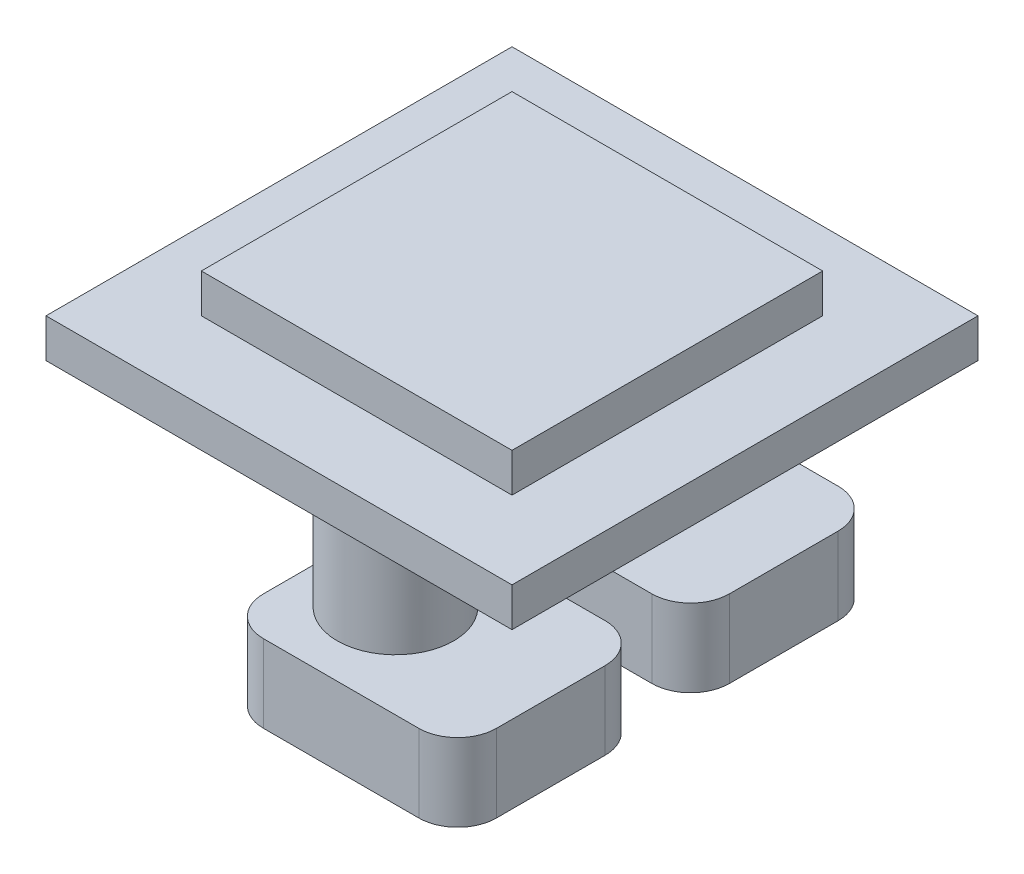
ISO-10303-21;
HEADER;
FILE_DESCRIPTION(('STEP AP214'),'2;1');
FILE_NAME('part.step','',(''),(''),'','','');
FILE_SCHEMA(('AUTOMOTIVE_DESIGN { 1 0 10303 214 1 1 1 1 }'));
ENDSEC;
DATA;
#1=APPLICATION_CONTEXT('core data for automotive mechanical design processes');
#2=APPLICATION_PROTOCOL_DEFINITION('international standard','automotive_design',2000,#1);
#3=PRODUCT_CONTEXT('',#1,'mechanical');
#4=PRODUCT('Part','Part','',(#3));
#5=PRODUCT_RELATED_PRODUCT_CATEGORY('part','',(#4));
#6=PRODUCT_DEFINITION_FORMATION('','',#4);
#7=PRODUCT_DEFINITION_CONTEXT('part definition',#1,'design');
#8=PRODUCT_DEFINITION('design','',#6,#7);
#9=PRODUCT_DEFINITION_SHAPE('','',#8);
#10=(LENGTH_UNIT() NAMED_UNIT(*) SI_UNIT(.MILLI.,.METRE.));
#11=(NAMED_UNIT(*) PLANE_ANGLE_UNIT() SI_UNIT($,.RADIAN.));
#12=(NAMED_UNIT(*) SI_UNIT($,.STERADIAN.) SOLID_ANGLE_UNIT());
#13=UNCERTAINTY_MEASURE_WITH_UNIT(LENGTH_MEASURE(1.E-05),#10,'distance_accuracy_value','');
#14=(GEOMETRIC_REPRESENTATION_CONTEXT(3) GLOBAL_UNCERTAINTY_ASSIGNED_CONTEXT((#13)) GLOBAL_UNIT_ASSIGNED_CONTEXT((#10,
#11,#12)) REPRESENTATION_CONTEXT('',''));
#15=CARTESIAN_POINT('',(0.,0.,0.));
#16=DIRECTION('',(0.,0.,1.));
#17=DIRECTION('',(1.,0.,0.));
#18=AXIS2_PLACEMENT_3D('',#15,#16,#17);
#19=CARTESIAN_POINT('',(0.,5.,0.));
#20=DIRECTION('',(1.,0.,0.));
#21=DIRECTION('',(0.,0.,-1.));
#22=AXIS2_PLACEMENT_3D('',#19,#20,#21);
#23=PLANE('',#22);
#24=DIRECTION('',(0.,0.,1.));
#25=VECTOR('',#24,1.);
#26=CARTESIAN_POINT('',(0.,0.,0.));
#27=LINE('',#26,#25);
#28=CARTESIAN_POINT('',(0.,0.,-40.));
#29=VERTEX_POINT('',#28);
#30=CARTESIAN_POINT('',(0.,0.,0.));
#31=VERTEX_POINT('',#30);
#32=EDGE_CURVE('E226',#29,#31,#27,.T.);
#33=ORIENTED_EDGE('',*,*,#32,.T.);
#34=DIRECTION('',(0.,-1.,0.));
#35=VECTOR('',#34,1.);
#36=CARTESIAN_POINT('',(0.,5.,0.));
#37=LINE('',#36,#35);
#38=CARTESIAN_POINT('',(0.,5.,0.));
#39=VERTEX_POINT('',#38);
#40=EDGE_CURVE('E261',#39,#31,#37,.T.);
#41=ORIENTED_EDGE('',*,*,#40,.F.);
#42=DIRECTION('',(0.,0.,1.));
#43=VECTOR('',#42,1.);
#44=CARTESIAN_POINT('',(0.,5.,0.));
#45=LINE('',#44,#43);
#46=CARTESIAN_POINT('',(0.,5.,-40.));
#47=VERTEX_POINT('',#46);
#48=EDGE_CURVE('E235',#47,#39,#45,.T.);
#49=ORIENTED_EDGE('',*,*,#48,.F.);
#50=DIRECTION('',(0.,-1.,0.));
#51=VECTOR('',#50,1.);
#52=CARTESIAN_POINT('',(0.,5.,-40.));
#53=LINE('',#52,#51);
#54=EDGE_CURVE('E244',#47,#29,#53,.T.);
#55=ORIENTED_EDGE('',*,*,#54,.T.);
#56=EDGE_LOOP('',(#33,#41,#49,#55));
#57=FACE_BOUND('',#56,.T.);
#58=ADVANCED_FACE('F39',(#57),#23,.F.);
#59=CARTESIAN_POINT('',(0.,5.,0.));
#60=DIRECTION('',(0.,0.,-1.));
#61=DIRECTION('',(-1.,0.,0.));
#62=AXIS2_PLACEMENT_3D('',#59,#60,#61);
#63=PLANE('',#62);
#64=DIRECTION('',(1.,0.,0.));
#65=VECTOR('',#64,1.);
#66=CARTESIAN_POINT('',(0.,0.,0.));
#67=LINE('',#66,#65);
#68=CARTESIAN_POINT('',(40.,0.,0.));
#69=VERTEX_POINT('',#68);
#70=EDGE_CURVE('E229',#31,#69,#67,.T.);
#71=ORIENTED_EDGE('',*,*,#70,.T.);
#72=DIRECTION('',(0.,-1.,0.));
#73=VECTOR('',#72,1.);
#74=CARTESIAN_POINT('',(40.,5.,0.));
#75=LINE('',#74,#73);
#76=CARTESIAN_POINT('',(40.,5.,0.));
#77=VERTEX_POINT('',#76);
#78=EDGE_CURVE('E258',#77,#69,#75,.T.);
#79=ORIENTED_EDGE('',*,*,#78,.F.);
#80=DIRECTION('',(1.,0.,0.));
#81=VECTOR('',#80,1.);
#82=CARTESIAN_POINT('',(0.,5.,0.));
#83=LINE('',#82,#81);
#84=EDGE_CURVE('E238',#39,#77,#83,.T.);
#85=ORIENTED_EDGE('',*,*,#84,.F.);
#86=ORIENTED_EDGE('',*,*,#40,.T.);
#87=EDGE_LOOP('',(#71,#79,#85,#86));
#88=FACE_BOUND('',#87,.T.);
#89=ADVANCED_FACE('F399',(#88),#63,.F.);
#90=CARTESIAN_POINT('',(40.,5.,0.));
#91=DIRECTION('',(-1.,0.,0.));
#92=DIRECTION('',(0.,0.,1.));
#93=AXIS2_PLACEMENT_3D('',#90,#91,#92);
#94=PLANE('',#93);
#95=DIRECTION('',(0.,0.,-1.));
#96=VECTOR('',#95,1.);
#97=CARTESIAN_POINT('',(40.,0.,0.));
#98=LINE('',#97,#96);
#99=CARTESIAN_POINT('',(40.,0.,-40.));
#100=VERTEX_POINT('',#99);
#101=EDGE_CURVE('E248',#69,#100,#98,.T.);
#102=ORIENTED_EDGE('',*,*,#101,.T.);
#103=DIRECTION('',(0.,-1.,0.));
#104=VECTOR('',#103,1.);
#105=CARTESIAN_POINT('',(40.,5.,-40.));
#106=LINE('',#105,#104);
#107=CARTESIAN_POINT('',(40.,5.,-40.));
#108=VERTEX_POINT('',#107);
#109=EDGE_CURVE('E255',#108,#100,#106,.T.);
#110=ORIENTED_EDGE('',*,*,#109,.F.);
#111=DIRECTION('',(0.,0.,-1.));
#112=VECTOR('',#111,1.);
#113=CARTESIAN_POINT('',(40.,5.,0.));
#114=LINE('',#113,#112);
#115=EDGE_CURVE('E241',#77,#108,#114,.T.);
#116=ORIENTED_EDGE('',*,*,#115,.F.);
#117=ORIENTED_EDGE('',*,*,#78,.T.);
#118=EDGE_LOOP('',(#102,#110,#116,#117));
#119=FACE_BOUND('',#118,.T.);
#120=ADVANCED_FACE('F405',(#119),#94,.F.);
#121=CARTESIAN_POINT('',(0.,5.,-40.));
#122=DIRECTION('',(0.,0.,1.));
#123=DIRECTION('',(1.,0.,0.));
#124=AXIS2_PLACEMENT_3D('',#121,#122,#123);
#125=PLANE('',#124);
#126=DIRECTION('',(-1.,0.,0.));
#127=VECTOR('',#126,1.);
#128=CARTESIAN_POINT('',(0.,0.,-40.));
#129=LINE('',#128,#127);
#130=EDGE_CURVE('E239',#100,#29,#129,.T.);
#131=ORIENTED_EDGE('',*,*,#130,.T.);
#132=ORIENTED_EDGE('',*,*,#54,.F.);
#133=DIRECTION('',(-1.,0.,0.));
#134=VECTOR('',#133,1.);
#135=CARTESIAN_POINT('',(0.,5.,-40.));
#136=LINE('',#135,#134);
#137=EDGE_CURVE('E243',#108,#47,#136,.T.);
#138=ORIENTED_EDGE('',*,*,#137,.F.);
#139=ORIENTED_EDGE('',*,*,#109,.T.);
#140=EDGE_LOOP('',(#131,#132,#138,#139));
#141=FACE_BOUND('',#140,.T.);
#142=ADVANCED_FACE('F558',(#141),#125,.F.);
#143=CARTESIAN_POINT('',(0.,5.,0.));
#144=DIRECTION('',(0.,-1.,0.));
#145=DIRECTION('',(0.,0.,-1.));
#146=AXIS2_PLACEMENT_3D('',#143,#144,#145);
#147=PLANE('',#146);
#148=ORIENTED_EDGE('',*,*,#48,.T.);
#149=ORIENTED_EDGE('',*,*,#84,.T.);
#150=ORIENTED_EDGE('',*,*,#115,.T.);
#151=ORIENTED_EDGE('',*,*,#137,.T.);
#152=EDGE_LOOP('',(#148,#149,#150,#151));
#153=FACE_BOUND('',#152,.T.);
#154=ADVANCED_FACE('F563',(#153),#147,.F.);
#155=CARTESIAN_POINT('',(-10.,-5.,10.));
#156=DIRECTION('',(1.,0.,0.));
#157=DIRECTION('',(0.,0.,-1.));
#158=AXIS2_PLACEMENT_3D('',#155,#156,#157);
#159=PLANE('',#158);
#160=DIRECTION('',(0.,0.,-1.));
#161=VECTOR('',#160,1.);
#162=CARTESIAN_POINT('',(-10.,0.,10.));
#163=LINE('',#162,#161);
#164=CARTESIAN_POINT('',(-10.,0.,10.));
#165=VERTEX_POINT('',#164);
#166=CARTESIAN_POINT('',(-10.,0.,-50.));
#167=VERTEX_POINT('',#166);
#168=EDGE_CURVE('E225',#165,#167,#163,.T.);
#169=ORIENTED_EDGE('',*,*,#168,.T.);
#170=DIRECTION('',(0.,1.,0.));
#171=VECTOR('',#170,1.);
#172=CARTESIAN_POINT('',(-10.,-5.,-50.));
#173=LINE('',#172,#171);
#174=CARTESIAN_POINT('',(-10.,-5.,-50.));
#175=VERTEX_POINT('',#174);
#176=EDGE_CURVE('E205',#175,#167,#173,.T.);
#177=ORIENTED_EDGE('',*,*,#176,.F.);
#178=DIRECTION('',(0.,0.,-1.));
#179=VECTOR('',#178,1.);
#180=CARTESIAN_POINT('',(-10.,-5.,10.));
#181=LINE('',#180,#179);
#182=CARTESIAN_POINT('',(-10.,-5.,10.));
#183=VERTEX_POINT('',#182);
#184=EDGE_CURVE('E212',#183,#175,#181,.T.);
#185=ORIENTED_EDGE('',*,*,#184,.F.);
#186=DIRECTION('',(0.,1.,0.));
#187=VECTOR('',#186,1.);
#188=CARTESIAN_POINT('',(-10.,-5.,10.));
#189=LINE('',#188,#187);
#190=EDGE_CURVE('E373',#183,#165,#189,.T.);
#191=ORIENTED_EDGE('',*,*,#190,.T.);
#192=EDGE_LOOP('',(#169,#177,#185,#191));
#193=FACE_BOUND('',#192,.T.);
#194=ADVANCED_FACE('F223',(#193),#159,.F.);
#195=CARTESIAN_POINT('',(-10.,-5.,-50.));
#196=DIRECTION('',(0.,0.,1.));
#197=DIRECTION('',(1.,0.,0.));
#198=AXIS2_PLACEMENT_3D('',#195,#196,#197);
#199=PLANE('',#198);
#200=DIRECTION('',(1.,0.,0.));
#201=VECTOR('',#200,1.);
#202=CARTESIAN_POINT('',(-10.,0.,-50.));
#203=LINE('',#202,#201);
#204=CARTESIAN_POINT('',(50.,0.,-50.));
#205=VERTEX_POINT('',#204);
#206=EDGE_CURVE('E375',#167,#205,#203,.T.);
#207=ORIENTED_EDGE('',*,*,#206,.T.);
#208=DIRECTION('',(0.,1.,0.));
#209=VECTOR('',#208,1.);
#210=CARTESIAN_POINT('',(50.,-5.,-50.));
#211=LINE('',#210,#209);
#212=CARTESIAN_POINT('',(50.,-5.,-50.));
#213=VERTEX_POINT('',#212);
#214=EDGE_CURVE('E208',#213,#205,#211,.T.);
#215=ORIENTED_EDGE('',*,*,#214,.F.);
#216=DIRECTION('',(1.,0.,0.));
#217=VECTOR('',#216,1.);
#218=CARTESIAN_POINT('',(-10.,-5.,-50.));
#219=LINE('',#218,#217);
#220=EDGE_CURVE('E201',#175,#213,#219,.T.);
#221=ORIENTED_EDGE('',*,*,#220,.F.);
#222=ORIENTED_EDGE('',*,*,#176,.T.);
#223=EDGE_LOOP('',(#207,#215,#221,#222));
#224=FACE_BOUND('',#223,.T.);
#225=ADVANCED_FACE('F203',(#224),#199,.F.);
#226=CARTESIAN_POINT('',(50.,-5.,10.));
#227=DIRECTION('',(-1.,0.,0.));
#228=DIRECTION('',(0.,0.,1.));
#229=AXIS2_PLACEMENT_3D('',#226,#227,#228);
#230=PLANE('',#229);
#231=DIRECTION('',(0.,0.,1.));
#232=VECTOR('',#231,1.);
#233=CARTESIAN_POINT('',(50.,0.,10.));
#234=LINE('',#233,#232);
#235=CARTESIAN_POINT('',(50.,0.,10.));
#236=VERTEX_POINT('',#235);
#237=EDGE_CURVE('E377',#205,#236,#234,.T.);
#238=ORIENTED_EDGE('',*,*,#237,.T.);
#239=DIRECTION('',(0.,1.,0.));
#240=VECTOR('',#239,1.);
#241=CARTESIAN_POINT('',(50.,-5.,10.));
#242=LINE('',#241,#240);
#243=CARTESIAN_POINT('',(50.,-5.,10.));
#244=VERTEX_POINT('',#243);
#245=EDGE_CURVE('E231',#244,#236,#242,.T.);
#246=ORIENTED_EDGE('',*,*,#245,.F.);
#247=DIRECTION('',(0.,0.,1.));
#248=VECTOR('',#247,1.);
#249=CARTESIAN_POINT('',(50.,-5.,10.));
#250=LINE('',#249,#248);
#251=EDGE_CURVE('E211',#213,#244,#250,.T.);
#252=ORIENTED_EDGE('',*,*,#251,.F.);
#253=ORIENTED_EDGE('',*,*,#214,.T.);
#254=EDGE_LOOP('',(#238,#246,#252,#253));
#255=FACE_BOUND('',#254,.T.);
#256=ADVANCED_FACE('F389',(#255),#230,.F.);
#257=CARTESIAN_POINT('',(-10.,-5.,10.));
#258=DIRECTION('',(0.,0.,-1.));
#259=DIRECTION('',(-1.,0.,0.));
#260=AXIS2_PLACEMENT_3D('',#257,#258,#259);
#261=PLANE('',#260);
#262=DIRECTION('',(-1.,0.,0.));
#263=VECTOR('',#262,1.);
#264=CARTESIAN_POINT('',(-10.,0.,10.));
#265=LINE('',#264,#263);
#266=EDGE_CURVE('E221',#236,#165,#265,.T.);
#267=ORIENTED_EDGE('',*,*,#266,.T.);
#268=ORIENTED_EDGE('',*,*,#190,.F.);
#269=DIRECTION('',(-1.,0.,0.));
#270=VECTOR('',#269,1.);
#271=CARTESIAN_POINT('',(-10.,-5.,10.));
#272=LINE('',#271,#270);
#273=EDGE_CURVE('E217',#244,#183,#272,.T.);
#274=ORIENTED_EDGE('',*,*,#273,.F.);
#275=ORIENTED_EDGE('',*,*,#245,.T.);
#276=EDGE_LOOP('',(#267,#268,#274,#275));
#277=FACE_BOUND('',#276,.T.);
#278=ADVANCED_FACE('F384',(#277),#261,.F.);
#279=CARTESIAN_POINT('',(0.,-5.,0.));
#280=DIRECTION('',(0.,-1.,0.));
#281=DIRECTION('',(0.,0.,-1.));
#282=AXIS2_PLACEMENT_3D('',#279,#280,#281);
#283=PLANE('',#282);
#284=CARTESIAN_POINT('',(20.,-5.,-35.));
#285=DIRECTION('',(0.,-1.,0.));
#286=DIRECTION('',(0.,0.,-1.));
#287=AXIS2_PLACEMENT_3D('',#284,#285,#286);
#288=CIRCLE('',#287,7.5);
#289=CARTESIAN_POINT('',(20.,-5.,-42.5));
#290=VERTEX_POINT('',#289);
#291=EDGE_CURVE('E268',#290,#290,#288,.T.);
#292=ORIENTED_EDGE('',*,*,#291,.F.);
#293=EDGE_LOOP('',(#292));
#294=FACE_BOUND('',#293,.T.);
#295=CARTESIAN_POINT('',(20.,-5.,-4.99999999999999));
#296=DIRECTION('',(0.,-1.,0.));
#297=DIRECTION('',(0.,0.,-1.));
#298=AXIS2_PLACEMENT_3D('',#295,#296,#297);
#299=CIRCLE('',#298,7.5);
#300=CARTESIAN_POINT('',(20.,-5.,-12.5));
#301=VERTEX_POINT('',#300);
#302=EDGE_CURVE('E368',#301,#301,#299,.T.);
#303=ORIENTED_EDGE('',*,*,#302,.F.);
#304=EDGE_LOOP('',(#303));
#305=FACE_BOUND('',#304,.T.);
#306=ORIENTED_EDGE('',*,*,#184,.T.);
#307=ORIENTED_EDGE('',*,*,#220,.T.);
#308=ORIENTED_EDGE('',*,*,#251,.T.);
#309=ORIENTED_EDGE('',*,*,#273,.T.);
#310=EDGE_LOOP('',(#306,#307,#308,#309));
#311=FACE_BOUND('',#310,.T.);
#312=ADVANCED_FACE('F215',(#294,#305,#311),#283,.T.);
#313=CARTESIAN_POINT('',(0.,0.,0.));
#314=DIRECTION('',(0.,-1.,0.));
#315=DIRECTION('',(0.,0.,-1.));
#316=AXIS2_PLACEMENT_3D('',#313,#314,#315);
#317=PLANE('',#316);
#318=ORIENTED_EDGE('',*,*,#32,.F.);
#319=ORIENTED_EDGE('',*,*,#130,.F.);
#320=ORIENTED_EDGE('',*,*,#101,.F.);
#321=ORIENTED_EDGE('',*,*,#70,.F.);
#322=EDGE_LOOP('',(#318,#319,#320,#321));
#323=FACE_BOUND('',#322,.T.);
#324=ORIENTED_EDGE('',*,*,#168,.F.);
#325=ORIENTED_EDGE('',*,*,#266,.F.);
#326=ORIENTED_EDGE('',*,*,#237,.F.);
#327=ORIENTED_EDGE('',*,*,#206,.F.);
#328=EDGE_LOOP('',(#324,#325,#326,#327));
#329=FACE_BOUND('',#328,.T.);
#330=ADVANCED_FACE('F388',(#323,#329),#317,.F.);
#331=CARTESIAN_POINT('',(20.,-35.,-4.99999999999999));
#332=DIRECTION('',(0.,1.,0.));
#333=DIRECTION('',(0.,0.,1.));
#334=AXIS2_PLACEMENT_3D('',#331,#332,#333);
#335=CYLINDRICAL_SURFACE('',#334,7.5);
#336=CARTESIAN_POINT('',(20.,-25.,-4.99999999999999));
#337=DIRECTION('',(0.,1.,0.));
#338=DIRECTION('',(0.,0.,1.));
#339=AXIS2_PLACEMENT_3D('',#336,#337,#338);
#340=CIRCLE('',#339,7.5);
#341=CARTESIAN_POINT('',(20.,-25.,2.50000000000001));
#342=VERTEX_POINT('',#341);
#343=EDGE_CURVE('E265',#342,#342,#340,.T.);
#344=ORIENTED_EDGE('',*,*,#343,.T.);
#345=EDGE_LOOP('',(#344));
#346=FACE_BOUND('',#345,.T.);
#347=ORIENTED_EDGE('',*,*,#302,.T.);
#348=EDGE_LOOP('',(#347));
#349=FACE_BOUND('',#348,.T.);
#350=ADVANCED_FACE('F540',(#346,#349),#335,.T.);
#351=CARTESIAN_POINT('',(20.,-35.,-35.));
#352=DIRECTION('',(0.,1.,0.));
#353=DIRECTION('',(0.,0.,1.));
#354=AXIS2_PLACEMENT_3D('',#351,#352,#353);
#355=CYLINDRICAL_SURFACE('',#354,7.5);
#356=CARTESIAN_POINT('',(20.,-25.,-35.));
#357=DIRECTION('',(0.,1.,0.));
#358=DIRECTION('',(0.,0.,1.));
#359=AXIS2_PLACEMENT_3D('',#356,#357,#358);
#360=CIRCLE('',#359,7.5);
#361=CARTESIAN_POINT('',(20.,-25.,-27.5));
#362=VERTEX_POINT('',#361);
#363=EDGE_CURVE('E270',#362,#362,#360,.T.);
#364=ORIENTED_EDGE('',*,*,#363,.T.);
#365=EDGE_LOOP('',(#364));
#366=FACE_BOUND('',#365,.T.);
#367=ORIENTED_EDGE('',*,*,#291,.T.);
#368=EDGE_LOOP('',(#367));
#369=FACE_BOUND('',#368,.T.);
#370=ADVANCED_FACE('F536',(#366,#369),#355,.T.);
#371=CARTESIAN_POINT('',(40.,-25.,7.00000000000001));
#372=DIRECTION('',(1.,0.,0.));
#373=DIRECTION('',(0.,0.,-1.));
#374=AXIS2_PLACEMENT_3D('',#371,#372,#373);
#375=PLANE('',#374);
#376=DIRECTION('',(0.,0.,1.));
#377=VECTOR('',#376,1.);
#378=CARTESIAN_POINT('',(40.,-35.,7.00000000000001));
#379=LINE('',#378,#377);
#380=CARTESIAN_POINT('',(40.,-35.,-12.));
#381=VERTEX_POINT('',#380);
#382=CARTESIAN_POINT('',(40.,-35.,2.00000000000001));
#383=VERTEX_POINT('',#382);
#384=EDGE_CURVE('E273',#381,#383,#379,.T.);
#385=ORIENTED_EDGE('',*,*,#384,.F.);
#386=DIRECTION('',(0.,-1.,0.));
#387=VECTOR('',#386,1.);
#388=CARTESIAN_POINT('',(40.,-25.,-12.));
#389=LINE('',#388,#387);
#390=CARTESIAN_POINT('',(40.,-25.,-12.));
#391=VERTEX_POINT('',#390);
#392=EDGE_CURVE('E11',#381,#391,#389,.F.);
#393=ORIENTED_EDGE('',*,*,#392,.T.);
#394=DIRECTION('',(0.,0.,1.));
#395=VECTOR('',#394,1.);
#396=CARTESIAN_POINT('',(40.,-25.,7.00000000000001));
#397=LINE('',#396,#395);
#398=CARTESIAN_POINT('',(40.,-25.,2.00000000000001));
#399=VERTEX_POINT('',#398);
#400=EDGE_CURVE('E347',#391,#399,#397,.T.);
#401=ORIENTED_EDGE('',*,*,#400,.T.);
#402=DIRECTION('',(0.,-1.,0.));
#403=VECTOR('',#402,1.);
#404=CARTESIAN_POINT('',(40.,-25.,2.00000000000001));
#405=LINE('',#404,#403);
#406=EDGE_CURVE('E47',#399,#383,#405,.T.);
#407=ORIENTED_EDGE('',*,*,#406,.T.);
#408=EDGE_LOOP('',(#385,#393,#401,#407));
#409=FACE_BOUND('',#408,.T.);
#410=ADVANCED_FACE('F344',(#409),#375,.T.);
#411=CARTESIAN_POINT('',(40.,-25.,-17.));
#412=DIRECTION('',(0.,0.,-1.));
#413=DIRECTION('',(-1.,0.,0.));
#414=AXIS2_PLACEMENT_3D('',#411,#412,#413);
#415=PLANE('',#414);
#416=DIRECTION('',(1.,0.,0.));
#417=VECTOR('',#416,1.);
#418=CARTESIAN_POINT('',(40.,-35.,-17.));
#419=LINE('',#418,#417);
#420=CARTESIAN_POINT('',(15.,-35.,-17.));
#421=VERTEX_POINT('',#420);
#422=CARTESIAN_POINT('',(35.,-35.,-17.));
#423=VERTEX_POINT('',#422);
#424=EDGE_CURVE('E364',#421,#423,#419,.T.);
#425=ORIENTED_EDGE('',*,*,#424,.F.);
#426=DIRECTION('',(0.,-1.,0.));
#427=VECTOR('',#426,1.);
#428=CARTESIAN_POINT('',(15.,-25.,-17.));
#429=LINE('',#428,#427);
#430=CARTESIAN_POINT('',(15.,-25.,-17.));
#431=VERTEX_POINT('',#430);
#432=EDGE_CURVE('E303',#421,#431,#429,.F.);
#433=ORIENTED_EDGE('',*,*,#432,.T.);
#434=DIRECTION('',(1.,0.,0.));
#435=VECTOR('',#434,1.);
#436=CARTESIAN_POINT('',(40.,-25.,-17.));
#437=LINE('',#436,#435);
#438=CARTESIAN_POINT('',(35.,-25.,-17.));
#439=VERTEX_POINT('',#438);
#440=EDGE_CURVE('E269',#431,#439,#437,.T.);
#441=ORIENTED_EDGE('',*,*,#440,.T.);
#442=DIRECTION('',(0.,-1.,0.));
#443=VECTOR('',#442,1.);
#444=CARTESIAN_POINT('',(35.,-25.,-17.));
#445=LINE('',#444,#443);
#446=EDGE_CURVE('E300',#439,#423,#445,.T.);
#447=ORIENTED_EDGE('',*,*,#446,.T.);
#448=EDGE_LOOP('',(#425,#433,#441,#447));
#449=FACE_BOUND('',#448,.T.);
#450=ADVANCED_FACE('F450',(#449),#415,.T.);
#451=CARTESIAN_POINT('',(9.99999999999999,-25.,7.00000000000001));
#452=DIRECTION('',(-1.,0.,0.));
#453=DIRECTION('',(0.,0.,1.));
#454=AXIS2_PLACEMENT_3D('',#451,#452,#453);
#455=PLANE('',#454);
#456=DIRECTION('',(0.,0.,-1.));
#457=VECTOR('',#456,1.);
#458=CARTESIAN_POINT('',(9.99999999999999,-35.,7.00000000000001));
#459=LINE('',#458,#457);
#460=CARTESIAN_POINT('',(9.99999999999999,-35.,2.00000000000001));
#461=VERTEX_POINT('',#460);
#462=CARTESIAN_POINT('',(9.99999999999999,-35.,-12.));
#463=VERTEX_POINT('',#462);
#464=EDGE_CURVE('E357',#461,#463,#459,.T.);
#465=ORIENTED_EDGE('',*,*,#464,.F.);
#466=DIRECTION('',(0.,-1.,0.));
#467=VECTOR('',#466,1.);
#468=CARTESIAN_POINT('',(9.99999999999999,-25.,2.00000000000001));
#469=LINE('',#468,#467);
#470=CARTESIAN_POINT('',(9.99999999999999,-25.,2.00000000000001));
#471=VERTEX_POINT('',#470);
#472=EDGE_CURVE('E290',#461,#471,#469,.F.);
#473=ORIENTED_EDGE('',*,*,#472,.T.);
#474=DIRECTION('',(0.,0.,-1.));
#475=VECTOR('',#474,1.);
#476=CARTESIAN_POINT('',(9.99999999999999,-25.,7.00000000000001));
#477=LINE('',#476,#475);
#478=CARTESIAN_POINT('',(9.99999999999999,-25.,-12.));
#479=VERTEX_POINT('',#478);
#480=EDGE_CURVE('E452',#471,#479,#477,.T.);
#481=ORIENTED_EDGE('',*,*,#480,.T.);
#482=DIRECTION('',(0.,-1.,0.));
#483=VECTOR('',#482,1.);
#484=CARTESIAN_POINT('',(9.99999999999999,-25.,-12.));
#485=LINE('',#484,#483);
#486=EDGE_CURVE('E287',#479,#463,#485,.T.);
#487=ORIENTED_EDGE('',*,*,#486,.T.);
#488=EDGE_LOOP('',(#465,#473,#481,#487));
#489=FACE_BOUND('',#488,.T.);
#490=ADVANCED_FACE('F529',(#489),#455,.T.);
#491=CARTESIAN_POINT('',(40.,-25.,7.00000000000001));
#492=DIRECTION('',(0.,0.,1.));
#493=DIRECTION('',(1.,0.,0.));
#494=AXIS2_PLACEMENT_3D('',#491,#492,#493);
#495=PLANE('',#494);
#496=DIRECTION('',(-1.,0.,0.));
#497=VECTOR('',#496,1.);
#498=CARTESIAN_POINT('',(40.,-25.,7.00000000000001));
#499=LINE('',#498,#497);
#500=CARTESIAN_POINT('',(35.,-25.,7.00000000000001));
#501=VERTEX_POINT('',#500);
#502=CARTESIAN_POINT('',(15.,-25.,7.00000000000001));
#503=VERTEX_POINT('',#502);
#504=EDGE_CURVE('E454',#501,#503,#499,.T.);
#505=ORIENTED_EDGE('',*,*,#504,.T.);
#506=DIRECTION('',(0.,-1.,0.));
#507=VECTOR('',#506,1.);
#508=CARTESIAN_POINT('',(15.,-25.,7.00000000000001));
#509=LINE('',#508,#507);
#510=CARTESIAN_POINT('',(15.,-35.,7.00000000000001));
#511=VERTEX_POINT('',#510);
#512=EDGE_CURVE('E276',#503,#511,#509,.T.);
#513=ORIENTED_EDGE('',*,*,#512,.T.);
#514=DIRECTION('',(-1.,0.,0.));
#515=VECTOR('',#514,1.);
#516=CARTESIAN_POINT('',(40.,-35.,7.00000000000001));
#517=LINE('',#516,#515);
#518=CARTESIAN_POINT('',(35.,-35.,7.00000000000001));
#519=VERTEX_POINT('',#518);
#520=EDGE_CURVE('E355',#519,#511,#517,.T.);
#521=ORIENTED_EDGE('',*,*,#520,.F.);
#522=DIRECTION('',(0.,-1.,0.));
#523=VECTOR('',#522,1.);
#524=CARTESIAN_POINT('',(35.,-25.,7.00000000000001));
#525=LINE('',#524,#523);
#526=EDGE_CURVE('E264',#519,#501,#525,.F.);
#527=ORIENTED_EDGE('',*,*,#526,.T.);
#528=EDGE_LOOP('',(#505,#513,#521,#527));
#529=FACE_BOUND('',#528,.T.);
#530=ADVANCED_FACE('F525',(#529),#495,.T.);
#531=CARTESIAN_POINT('',(0.,-25.,0.));
#532=DIRECTION('',(0.,1.,0.));
#533=DIRECTION('',(0.,0.,1.));
#534=AXIS2_PLACEMENT_3D('',#531,#532,#533);
#535=PLANE('',#534);
#536=ORIENTED_EDGE('',*,*,#343,.F.);
#537=EDGE_LOOP('',(#536));
#538=FACE_BOUND('',#537,.T.);
#539=ORIENTED_EDGE('',*,*,#480,.F.);
#540=CARTESIAN_POINT('',(15.,-25.,2.00000000000001));
#541=DIRECTION('',(0.,1.,0.));
#542=DIRECTION('',(0.,0.,1.));
#543=AXIS2_PLACEMENT_3D('',#540,#541,#542);
#544=CIRCLE('',#543,5.);
#545=EDGE_CURVE('E298',#471,#503,#544,.T.);
#546=ORIENTED_EDGE('',*,*,#545,.T.);
#547=ORIENTED_EDGE('',*,*,#504,.F.);
#548=CARTESIAN_POINT('',(35.,-25.,2.00000000000001));
#549=DIRECTION('',(0.,1.,0.));
#550=DIRECTION('',(0.,0.,1.));
#551=AXIS2_PLACEMENT_3D('',#548,#549,#550);
#552=CIRCLE('',#551,5.);
#553=EDGE_CURVE('E292',#501,#399,#552,.T.);
#554=ORIENTED_EDGE('',*,*,#553,.T.);
#555=ORIENTED_EDGE('',*,*,#400,.F.);
#556=CARTESIAN_POINT('',(35.,-25.,-12.));
#557=DIRECTION('',(0.,1.,0.));
#558=DIRECTION('',(0.,0.,1.));
#559=AXIS2_PLACEMENT_3D('',#556,#557,#558);
#560=CIRCLE('',#559,5.);
#561=EDGE_CURVE('E294',#391,#439,#560,.T.);
#562=ORIENTED_EDGE('',*,*,#561,.T.);
#563=ORIENTED_EDGE('',*,*,#440,.F.);
#564=CARTESIAN_POINT('',(15.,-25.,-12.));
#565=DIRECTION('',(0.,1.,0.));
#566=DIRECTION('',(0.,0.,1.));
#567=AXIS2_PLACEMENT_3D('',#564,#565,#566);
#568=CIRCLE('',#567,5.);
#569=EDGE_CURVE('E296',#431,#479,#568,.T.);
#570=ORIENTED_EDGE('',*,*,#569,.T.);
#571=EDGE_LOOP('',(#539,#546,#547,#554,#555,#562,#563,#570));
#572=FACE_BOUND('',#571,.T.);
#573=ADVANCED_FACE('F446',(#538,#572),#535,.T.);
#574=CARTESIAN_POINT('',(20.,-35.,-4.99999999999999));
#575=DIRECTION('',(0.,-1.,0.));
#576=DIRECTION('',(0.,0.,-1.));
#577=AXIS2_PLACEMENT_3D('',#574,#575,#576);
#578=PLANE('',#577);
#579=ORIENTED_EDGE('',*,*,#520,.T.);
#580=CARTESIAN_POINT('',(15.,-35.,2.00000000000001));
#581=DIRECTION('',(0.,-1.,0.));
#582=DIRECTION('',(0.,0.,-1.));
#583=AXIS2_PLACEMENT_3D('',#580,#581,#582);
#584=CIRCLE('',#583,5.);
#585=EDGE_CURVE('E285',#511,#461,#584,.T.);
#586=ORIENTED_EDGE('',*,*,#585,.T.);
#587=ORIENTED_EDGE('',*,*,#464,.T.);
#588=CARTESIAN_POINT('',(15.,-35.,-12.));
#589=DIRECTION('',(0.,-1.,0.));
#590=DIRECTION('',(0.,0.,-1.));
#591=AXIS2_PLACEMENT_3D('',#588,#589,#590);
#592=CIRCLE('',#591,5.);
#593=EDGE_CURVE('E283',#463,#421,#592,.T.);
#594=ORIENTED_EDGE('',*,*,#593,.T.);
#595=ORIENTED_EDGE('',*,*,#424,.T.);
#596=CARTESIAN_POINT('',(35.,-35.,-12.));
#597=DIRECTION('',(0.,-1.,0.));
#598=DIRECTION('',(0.,0.,-1.));
#599=AXIS2_PLACEMENT_3D('',#596,#597,#598);
#600=CIRCLE('',#599,5.);
#601=EDGE_CURVE('E281',#423,#381,#600,.T.);
#602=ORIENTED_EDGE('',*,*,#601,.T.);
#603=ORIENTED_EDGE('',*,*,#384,.T.);
#604=CARTESIAN_POINT('',(35.,-35.,2.00000000000001));
#605=DIRECTION('',(0.,-1.,0.));
#606=DIRECTION('',(0.,0.,-1.));
#607=AXIS2_PLACEMENT_3D('',#604,#605,#606);
#608=CIRCLE('',#607,5.);
#609=EDGE_CURVE('E279',#383,#519,#608,.T.);
#610=ORIENTED_EDGE('',*,*,#609,.T.);
#611=EDGE_LOOP('',(#579,#586,#587,#594,#595,#602,#603,#610));
#612=FACE_BOUND('',#611,.T.);
#613=ADVANCED_FACE('F352',(#612),#578,.T.);
#614=CARTESIAN_POINT('',(40.,-25.,-23.));
#615=DIRECTION('',(1.,0.,0.));
#616=DIRECTION('',(0.,0.,-1.));
#617=AXIS2_PLACEMENT_3D('',#614,#615,#616);
#618=PLANE('',#617);
#619=DIRECTION('',(0.,0.,1.));
#620=VECTOR('',#619,1.);
#621=CARTESIAN_POINT('',(40.,-35.,-23.));
#622=LINE('',#621,#620);
#623=CARTESIAN_POINT('',(40.,-35.,-42.));
#624=VERTEX_POINT('',#623);
#625=CARTESIAN_POINT('',(40.,-35.,-28.));
#626=VERTEX_POINT('',#625);
#627=EDGE_CURVE('E471',#624,#626,#622,.T.);
#628=ORIENTED_EDGE('',*,*,#627,.F.);
#629=DIRECTION('',(0.,-1.,0.));
#630=VECTOR('',#629,1.);
#631=CARTESIAN_POINT('',(40.,-25.,-42.));
#632=LINE('',#631,#630);
#633=CARTESIAN_POINT('',(40.,-25.,-42.));
#634=VERTEX_POINT('',#633);
#635=EDGE_CURVE('E337',#624,#634,#632,.F.);
#636=ORIENTED_EDGE('',*,*,#635,.T.);
#637=DIRECTION('',(0.,0.,1.));
#638=VECTOR('',#637,1.);
#639=CARTESIAN_POINT('',(40.,-25.,-23.));
#640=LINE('',#639,#638);
#641=CARTESIAN_POINT('',(40.,-25.,-28.));
#642=VERTEX_POINT('',#641);
#643=EDGE_CURVE('E464',#634,#642,#640,.T.);
#644=ORIENTED_EDGE('',*,*,#643,.T.);
#645=DIRECTION('',(0.,-1.,0.));
#646=VECTOR('',#645,1.);
#647=CARTESIAN_POINT('',(40.,-25.,-28.));
#648=LINE('',#647,#646);
#649=EDGE_CURVE('E334',#642,#626,#648,.T.);
#650=ORIENTED_EDGE('',*,*,#649,.T.);
#651=EDGE_LOOP('',(#628,#636,#644,#650));
#652=FACE_BOUND('',#651,.T.);
#653=ADVANCED_FACE('F485',(#652),#618,.T.);
#654=CARTESIAN_POINT('',(40.,-25.,-47.));
#655=DIRECTION('',(0.,0.,-1.));
#656=DIRECTION('',(-1.,0.,0.));
#657=AXIS2_PLACEMENT_3D('',#654,#655,#656);
#658=PLANE('',#657);
#659=DIRECTION('',(1.,0.,0.));
#660=VECTOR('',#659,1.);
#661=CARTESIAN_POINT('',(40.,-35.,-47.));
#662=LINE('',#661,#660);
#663=CARTESIAN_POINT('',(15.,-35.,-47.));
#664=VERTEX_POINT('',#663);
#665=CARTESIAN_POINT('',(35.,-35.,-47.));
#666=VERTEX_POINT('',#665);
#667=EDGE_CURVE('E461',#664,#666,#662,.T.);
#668=ORIENTED_EDGE('',*,*,#667,.F.);
#669=DIRECTION('',(0.,-1.,0.));
#670=VECTOR('',#669,1.);
#671=CARTESIAN_POINT('',(15.,-25.,-47.));
#672=LINE('',#671,#670);
#673=CARTESIAN_POINT('',(15.,-25.,-47.));
#674=VERTEX_POINT('',#673);
#675=EDGE_CURVE('E61',#664,#674,#672,.F.);
#676=ORIENTED_EDGE('',*,*,#675,.T.);
#677=DIRECTION('',(1.,0.,0.));
#678=VECTOR('',#677,1.);
#679=CARTESIAN_POINT('',(40.,-25.,-47.));
#680=LINE('',#679,#678);
#681=CARTESIAN_POINT('',(35.,-25.,-47.));
#682=VERTEX_POINT('',#681);
#683=EDGE_CURVE('E274',#674,#682,#680,.T.);
#684=ORIENTED_EDGE('',*,*,#683,.T.);
#685=DIRECTION('',(0.,-1.,0.));
#686=VECTOR('',#685,1.);
#687=CARTESIAN_POINT('',(35.,-25.,-47.));
#688=LINE('',#687,#686);
#689=EDGE_CURVE('E330',#682,#666,#688,.T.);
#690=ORIENTED_EDGE('',*,*,#689,.T.);
#691=EDGE_LOOP('',(#668,#676,#684,#690));
#692=FACE_BOUND('',#691,.T.);
#693=ADVANCED_FACE('F503',(#692),#658,.T.);
#694=CARTESIAN_POINT('',(9.99999999999999,-25.,-23.));
#695=DIRECTION('',(-1.,0.,0.));
#696=DIRECTION('',(0.,0.,1.));
#697=AXIS2_PLACEMENT_3D('',#694,#695,#696);
#698=PLANE('',#697);
#699=DIRECTION('',(0.,0.,-1.));
#700=VECTOR('',#699,1.);
#701=CARTESIAN_POINT('',(9.99999999999999,-35.,-23.));
#702=LINE('',#701,#700);
#703=CARTESIAN_POINT('',(9.99999999999999,-35.,-28.));
#704=VERTEX_POINT('',#703);
#705=CARTESIAN_POINT('',(9.99999999999999,-35.,-42.));
#706=VERTEX_POINT('',#705);
#707=EDGE_CURVE('E465',#704,#706,#702,.T.);
#708=ORIENTED_EDGE('',*,*,#707,.F.);
#709=DIRECTION('',(0.,-1.,0.));
#710=VECTOR('',#709,1.);
#711=CARTESIAN_POINT('',(9.99999999999999,-25.,-28.));
#712=LINE('',#711,#710);
#713=CARTESIAN_POINT('',(9.99999999999999,-25.,-28.));
#714=VERTEX_POINT('',#713);
#715=EDGE_CURVE('E321',#704,#714,#712,.F.);
#716=ORIENTED_EDGE('',*,*,#715,.T.);
#717=DIRECTION('',(0.,0.,-1.));
#718=VECTOR('',#717,1.);
#719=CARTESIAN_POINT('',(9.99999999999999,-25.,-23.));
#720=LINE('',#719,#718);
#721=CARTESIAN_POINT('',(9.99999999999999,-25.,-42.));
#722=VERTEX_POINT('',#721);
#723=EDGE_CURVE('E475',#714,#722,#720,.T.);
#724=ORIENTED_EDGE('',*,*,#723,.T.);
#725=DIRECTION('',(0.,-1.,0.));
#726=VECTOR('',#725,1.);
#727=CARTESIAN_POINT('',(9.99999999999999,-25.,-42.));
#728=LINE('',#727,#726);
#729=EDGE_CURVE('E318',#722,#706,#728,.T.);
#730=ORIENTED_EDGE('',*,*,#729,.T.);
#731=EDGE_LOOP('',(#708,#716,#724,#730));
#732=FACE_BOUND('',#731,.T.);
#733=ADVANCED_FACE('F499',(#732),#698,.T.);
#734=CARTESIAN_POINT('',(40.,-25.,-23.));
#735=DIRECTION('',(0.,0.,1.));
#736=DIRECTION('',(1.,0.,0.));
#737=AXIS2_PLACEMENT_3D('',#734,#735,#736);
#738=PLANE('',#737);
#739=DIRECTION('',(-1.,0.,0.));
#740=VECTOR('',#739,1.);
#741=CARTESIAN_POINT('',(40.,-25.,-23.));
#742=LINE('',#741,#740);
#743=CARTESIAN_POINT('',(35.,-25.,-23.));
#744=VERTEX_POINT('',#743);
#745=CARTESIAN_POINT('',(15.,-25.,-23.));
#746=VERTEX_POINT('',#745);
#747=EDGE_CURVE('E478',#744,#746,#742,.T.);
#748=ORIENTED_EDGE('',*,*,#747,.T.);
#749=DIRECTION('',(0.,-1.,0.));
#750=VECTOR('',#749,1.);
#751=CARTESIAN_POINT('',(15.,-25.,-23.));
#752=LINE('',#751,#750);
#753=CARTESIAN_POINT('',(15.,-35.,-23.));
#754=VERTEX_POINT('',#753);
#755=EDGE_CURVE('E307',#746,#754,#752,.T.);
#756=ORIENTED_EDGE('',*,*,#755,.T.);
#757=DIRECTION('',(-1.,0.,0.));
#758=VECTOR('',#757,1.);
#759=CARTESIAN_POINT('',(40.,-35.,-23.));
#760=LINE('',#759,#758);
#761=CARTESIAN_POINT('',(35.,-35.,-23.));
#762=VERTEX_POINT('',#761);
#763=EDGE_CURVE('E468',#762,#754,#760,.T.);
#764=ORIENTED_EDGE('',*,*,#763,.F.);
#765=DIRECTION('',(0.,-1.,0.));
#766=VECTOR('',#765,1.);
#767=CARTESIAN_POINT('',(35.,-25.,-23.));
#768=LINE('',#767,#766);
#769=EDGE_CURVE('E305',#762,#744,#768,.F.);
#770=ORIENTED_EDGE('',*,*,#769,.T.);
#771=EDGE_LOOP('',(#748,#756,#764,#770));
#772=FACE_BOUND('',#771,.T.);
#773=ADVANCED_FACE('F492',(#772),#738,.T.);
#774=CARTESIAN_POINT('',(0.,-25.,0.));
#775=DIRECTION('',(0.,1.,0.));
#776=DIRECTION('',(0.,0.,1.));
#777=AXIS2_PLACEMENT_3D('',#774,#775,#776);
#778=PLANE('',#777);
#779=ORIENTED_EDGE('',*,*,#363,.F.);
#780=EDGE_LOOP('',(#779));
#781=FACE_BOUND('',#780,.T.);
#782=ORIENTED_EDGE('',*,*,#723,.F.);
#783=CARTESIAN_POINT('',(15.,-25.,-28.));
#784=DIRECTION('',(0.,1.,0.));
#785=DIRECTION('',(0.,0.,1.));
#786=AXIS2_PLACEMENT_3D('',#783,#784,#785);
#787=CIRCLE('',#786,5.);
#788=EDGE_CURVE('E328',#714,#746,#787,.T.);
#789=ORIENTED_EDGE('',*,*,#788,.T.);
#790=ORIENTED_EDGE('',*,*,#747,.F.);
#791=CARTESIAN_POINT('',(35.,-25.,-28.));
#792=DIRECTION('',(0.,1.,0.));
#793=DIRECTION('',(0.,0.,1.));
#794=AXIS2_PLACEMENT_3D('',#791,#792,#793);
#795=CIRCLE('',#794,5.);
#796=EDGE_CURVE('E323',#744,#642,#795,.T.);
#797=ORIENTED_EDGE('',*,*,#796,.T.);
#798=ORIENTED_EDGE('',*,*,#643,.F.);
#799=CARTESIAN_POINT('',(35.,-25.,-42.));
#800=DIRECTION('',(0.,1.,0.));
#801=DIRECTION('',(0.,0.,1.));
#802=AXIS2_PLACEMENT_3D('',#799,#800,#801);
#803=CIRCLE('',#802,5.);
#804=EDGE_CURVE('E54',#634,#682,#803,.T.);
#805=ORIENTED_EDGE('',*,*,#804,.T.);
#806=ORIENTED_EDGE('',*,*,#683,.F.);
#807=CARTESIAN_POINT('',(15.,-25.,-42.));
#808=DIRECTION('',(0.,1.,0.));
#809=DIRECTION('',(0.,0.,1.));
#810=AXIS2_PLACEMENT_3D('',#807,#808,#809);
#811=CIRCLE('',#810,5.);
#812=EDGE_CURVE('E326',#674,#722,#811,.T.);
#813=ORIENTED_EDGE('',*,*,#812,.T.);
#814=EDGE_LOOP('',(#782,#789,#790,#797,#798,#805,#806,#813));
#815=FACE_BOUND('',#814,.T.);
#816=ADVANCED_FACE('F505',(#781,#815),#778,.T.);
#817=CARTESIAN_POINT('',(20.,-35.,-35.));
#818=DIRECTION('',(0.,-1.,0.));
#819=DIRECTION('',(0.,0.,-1.));
#820=AXIS2_PLACEMENT_3D('',#817,#818,#819);
#821=PLANE('',#820);
#822=ORIENTED_EDGE('',*,*,#763,.T.);
#823=CARTESIAN_POINT('',(15.,-35.,-28.));
#824=DIRECTION('',(0.,-1.,0.));
#825=DIRECTION('',(0.,0.,-1.));
#826=AXIS2_PLACEMENT_3D('',#823,#824,#825);
#827=CIRCLE('',#826,5.);
#828=EDGE_CURVE('E316',#754,#704,#827,.T.);
#829=ORIENTED_EDGE('',*,*,#828,.T.);
#830=ORIENTED_EDGE('',*,*,#707,.T.);
#831=CARTESIAN_POINT('',(15.,-35.,-42.));
#832=DIRECTION('',(0.,-1.,0.));
#833=DIRECTION('',(0.,0.,-1.));
#834=AXIS2_PLACEMENT_3D('',#831,#832,#833);
#835=CIRCLE('',#834,5.);
#836=EDGE_CURVE('E314',#706,#664,#835,.T.);
#837=ORIENTED_EDGE('',*,*,#836,.T.);
#838=ORIENTED_EDGE('',*,*,#667,.T.);
#839=CARTESIAN_POINT('',(35.,-35.,-42.));
#840=DIRECTION('',(0.,-1.,0.));
#841=DIRECTION('',(0.,0.,-1.));
#842=AXIS2_PLACEMENT_3D('',#839,#840,#841);
#843=CIRCLE('',#842,5.);
#844=EDGE_CURVE('E312',#666,#624,#843,.T.);
#845=ORIENTED_EDGE('',*,*,#844,.T.);
#846=ORIENTED_EDGE('',*,*,#627,.T.);
#847=CARTESIAN_POINT('',(35.,-35.,-28.));
#848=DIRECTION('',(0.,-1.,0.));
#849=DIRECTION('',(0.,0.,-1.));
#850=AXIS2_PLACEMENT_3D('',#847,#848,#849);
#851=CIRCLE('',#850,5.);
#852=EDGE_CURVE('E310',#626,#762,#851,.T.);
#853=ORIENTED_EDGE('',*,*,#852,.T.);
#854=EDGE_LOOP('',(#822,#829,#830,#837,#838,#845,#846,#853));
#855=FACE_BOUND('',#854,.T.);
#856=ADVANCED_FACE('F414',(#855),#821,.T.);
#857=CARTESIAN_POINT('',(15.,-25.,2.00000000000001));
#858=DIRECTION('',(0.,-1.,0.));
#859=DIRECTION('',(0.,0.,-1.));
#860=AXIS2_PLACEMENT_3D('',#857,#858,#859);
#861=CYLINDRICAL_SURFACE('',#860,5.);
#862=ORIENTED_EDGE('',*,*,#545,.F.);
#863=ORIENTED_EDGE('',*,*,#472,.F.);
#864=ORIENTED_EDGE('',*,*,#585,.F.);
#865=ORIENTED_EDGE('',*,*,#512,.F.);
#866=EDGE_LOOP('',(#862,#863,#864,#865));
#867=FACE_BOUND('',#866,.T.);
#868=ADVANCED_FACE('F410',(#867),#861,.T.);
#869=CARTESIAN_POINT('',(15.,-25.,-12.));
#870=DIRECTION('',(0.,-1.,0.));
#871=DIRECTION('',(0.,0.,-1.));
#872=AXIS2_PLACEMENT_3D('',#869,#870,#871);
#873=CYLINDRICAL_SURFACE('',#872,5.);
#874=ORIENTED_EDGE('',*,*,#569,.F.);
#875=ORIENTED_EDGE('',*,*,#432,.F.);
#876=ORIENTED_EDGE('',*,*,#593,.F.);
#877=ORIENTED_EDGE('',*,*,#486,.F.);
#878=EDGE_LOOP('',(#874,#875,#876,#877));
#879=FACE_BOUND('',#878,.T.);
#880=ADVANCED_FACE('F413',(#879),#873,.T.);
#881=CARTESIAN_POINT('',(15.,-25.,-28.));
#882=DIRECTION('',(0.,-1.,0.));
#883=DIRECTION('',(0.,0.,-1.));
#884=AXIS2_PLACEMENT_3D('',#881,#882,#883);
#885=CYLINDRICAL_SURFACE('',#884,5.);
#886=ORIENTED_EDGE('',*,*,#788,.F.);
#887=ORIENTED_EDGE('',*,*,#715,.F.);
#888=ORIENTED_EDGE('',*,*,#828,.F.);
#889=ORIENTED_EDGE('',*,*,#755,.F.);
#890=EDGE_LOOP('',(#886,#887,#888,#889));
#891=FACE_BOUND('',#890,.T.);
#892=ADVANCED_FACE('F418',(#891),#885,.T.);
#893=CARTESIAN_POINT('',(15.,-25.,-42.));
#894=DIRECTION('',(0.,-1.,0.));
#895=DIRECTION('',(0.,0.,-1.));
#896=AXIS2_PLACEMENT_3D('',#893,#894,#895);
#897=CYLINDRICAL_SURFACE('',#896,5.);
#898=ORIENTED_EDGE('',*,*,#812,.F.);
#899=ORIENTED_EDGE('',*,*,#675,.F.);
#900=ORIENTED_EDGE('',*,*,#836,.F.);
#901=ORIENTED_EDGE('',*,*,#729,.F.);
#902=EDGE_LOOP('',(#898,#899,#900,#901));
#903=FACE_BOUND('',#902,.T.);
#904=ADVANCED_FACE('F422',(#903),#897,.T.);
#905=CARTESIAN_POINT('',(35.,-25.,-42.));
#906=DIRECTION('',(0.,-1.,0.));
#907=DIRECTION('',(0.,0.,-1.));
#908=AXIS2_PLACEMENT_3D('',#905,#906,#907);
#909=CYLINDRICAL_SURFACE('',#908,5.);
#910=ORIENTED_EDGE('',*,*,#804,.F.);
#911=ORIENTED_EDGE('',*,*,#635,.F.);
#912=ORIENTED_EDGE('',*,*,#844,.F.);
#913=ORIENTED_EDGE('',*,*,#689,.F.);
#914=EDGE_LOOP('',(#910,#911,#912,#913));
#915=FACE_BOUND('',#914,.T.);
#916=ADVANCED_FACE('F426',(#915),#909,.T.);
#917=CARTESIAN_POINT('',(35.,-25.,-28.));
#918=DIRECTION('',(0.,-1.,0.));
#919=DIRECTION('',(0.,0.,-1.));
#920=AXIS2_PLACEMENT_3D('',#917,#918,#919);
#921=CYLINDRICAL_SURFACE('',#920,5.);
#922=ORIENTED_EDGE('',*,*,#796,.F.);
#923=ORIENTED_EDGE('',*,*,#769,.F.);
#924=ORIENTED_EDGE('',*,*,#852,.F.);
#925=ORIENTED_EDGE('',*,*,#649,.F.);
#926=EDGE_LOOP('',(#922,#923,#924,#925));
#927=FACE_BOUND('',#926,.T.);
#928=ADVANCED_FACE('F430',(#927),#921,.T.);
#929=CARTESIAN_POINT('',(35.,-25.,-12.));
#930=DIRECTION('',(0.,-1.,0.));
#931=DIRECTION('',(0.,0.,-1.));
#932=AXIS2_PLACEMENT_3D('',#929,#930,#931);
#933=CYLINDRICAL_SURFACE('',#932,5.);
#934=ORIENTED_EDGE('',*,*,#561,.F.);
#935=ORIENTED_EDGE('',*,*,#392,.F.);
#936=ORIENTED_EDGE('',*,*,#601,.F.);
#937=ORIENTED_EDGE('',*,*,#446,.F.);
#938=EDGE_LOOP('',(#934,#935,#936,#937));
#939=FACE_BOUND('',#938,.T.);
#940=ADVANCED_FACE('F433',(#939),#933,.T.);
#941=CARTESIAN_POINT('',(35.,-25.,2.00000000000001));
#942=DIRECTION('',(0.,-1.,0.));
#943=DIRECTION('',(0.,0.,-1.));
#944=AXIS2_PLACEMENT_3D('',#941,#942,#943);
#945=CYLINDRICAL_SURFACE('',#944,5.);
#946=ORIENTED_EDGE('',*,*,#553,.F.);
#947=ORIENTED_EDGE('',*,*,#526,.F.);
#948=ORIENTED_EDGE('',*,*,#609,.F.);
#949=ORIENTED_EDGE('',*,*,#406,.F.);
#950=EDGE_LOOP('',(#946,#947,#948,#949));
#951=FACE_BOUND('',#950,.T.);
#952=ADVANCED_FACE('F41',(#951),#945,.T.);
#953=CLOSED_SHELL('',(#58,#89,#120,#142,#154,#194,#225,#256,#278,#312,#330,#350,#370,#410,#450,
#490,#530,#573,#613,#653,#693,#733,#773,#816,#856,#868,#880,#892,#904,#916,#928,#940,#952));
#954=MANIFOLD_SOLID_BREP('B2',#953);
#955=ADVANCED_BREP_SHAPE_REPRESENTATION('',(#18,#954),#14);
#956=SHAPE_DEFINITION_REPRESENTATION(#9,#955);
ENDSEC;
END-ISO-10303-21;
